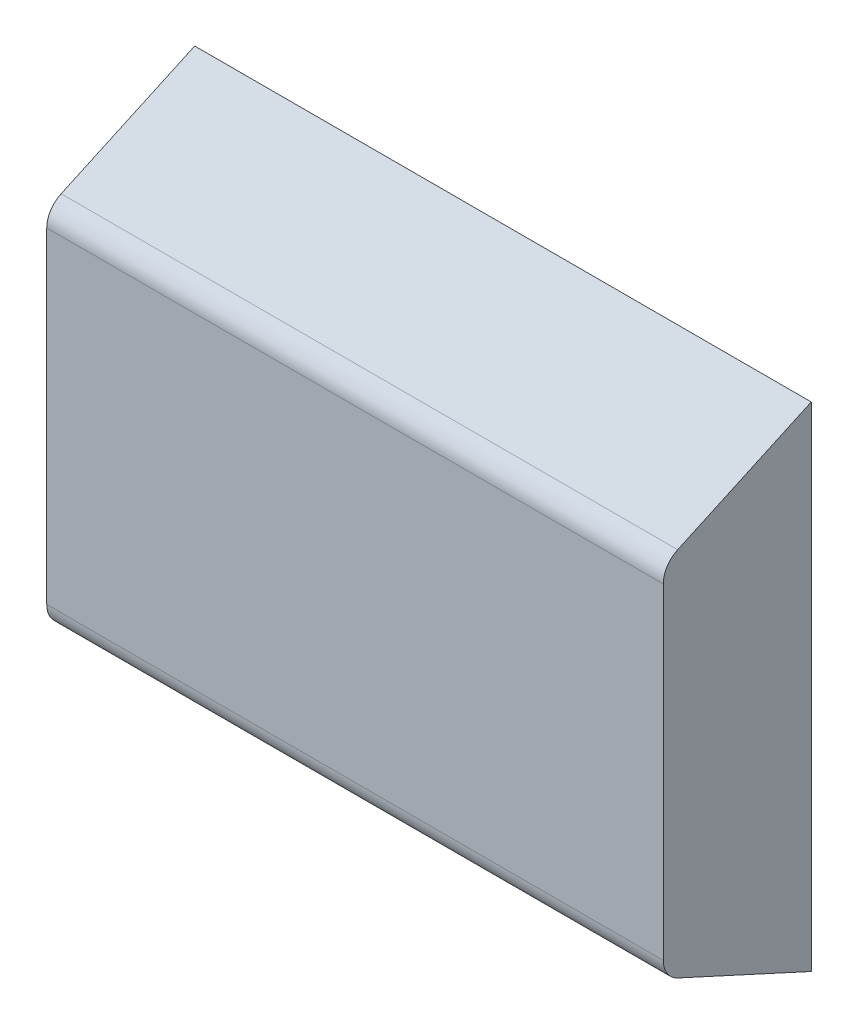
ISO-10303-21;
HEADER;
FILE_DESCRIPTION(('STEP AP214'),'2;1');
FILE_NAME('part.step','',(''),(''),'','','');
FILE_SCHEMA(('AUTOMOTIVE_DESIGN { 1 0 10303 214 1 1 1 1 }'));
ENDSEC;
DATA;
#1=APPLICATION_CONTEXT('core data for automotive mechanical design processes');
#2=APPLICATION_PROTOCOL_DEFINITION('international standard','automotive_design',2000,#1);
#3=PRODUCT_CONTEXT('',#1,'mechanical');
#4=PRODUCT('Part','Part','',(#3));
#5=PRODUCT_RELATED_PRODUCT_CATEGORY('part','',(#4));
#6=PRODUCT_DEFINITION_FORMATION('','',#4);
#7=PRODUCT_DEFINITION_CONTEXT('part definition',#1,'design');
#8=PRODUCT_DEFINITION('design','',#6,#7);
#9=PRODUCT_DEFINITION_SHAPE('','',#8);
#10=(LENGTH_UNIT() NAMED_UNIT(*) SI_UNIT(.MILLI.,.METRE.));
#11=(NAMED_UNIT(*) PLANE_ANGLE_UNIT() SI_UNIT($,.RADIAN.));
#12=(NAMED_UNIT(*) SI_UNIT($,.STERADIAN.) SOLID_ANGLE_UNIT());
#13=UNCERTAINTY_MEASURE_WITH_UNIT(LENGTH_MEASURE(1.E-05),#10,'distance_accuracy_value','');
#14=(GEOMETRIC_REPRESENTATION_CONTEXT(3) GLOBAL_UNCERTAINTY_ASSIGNED_CONTEXT((#13)) GLOBAL_UNIT_ASSIGNED_CONTEXT((#10,
#11,#12)) REPRESENTATION_CONTEXT('',''));
#15=CARTESIAN_POINT('',(0.,0.,0.));
#16=DIRECTION('',(0.,0.,1.));
#17=DIRECTION('',(1.,0.,0.));
#18=AXIS2_PLACEMENT_3D('',#15,#16,#17);
#19=CARTESIAN_POINT('',(0.,0.5,1.1));
#20=DIRECTION('',(0.,0.,1.));
#21=DIRECTION('',(1.,0.,0.));
#22=AXIS2_PLACEMENT_3D('',#19,#20,#21);
#23=PLANE('',#22);
#24=DIRECTION('',(0.,1.,0.));
#25=VECTOR('',#24,1.);
#26=CARTESIAN_POINT('',(0.,0.5,1.1));
#27=LINE('',#26,#25);
#28=CARTESIAN_POINT('',(0.,2.161099693397,1.1));
#29=VERTEX_POINT('',#28);
#30=CARTESIAN_POINT('',(0.,0.838900306603,1.1));
#31=VERTEX_POINT('',#30);
#32=EDGE_CURVE('E73',#29,#31,#27,.F.);
#33=ORIENTED_EDGE('',*,*,#32,.T.);
#34=DIRECTION('',(1.,0.,0.));
#35=VECTOR('',#34,1.);
#36=CARTESIAN_POINT('',(0.,0.838900306603,1.1));
#37=LINE('',#36,#35);
#38=CARTESIAN_POINT('',(2.5,0.838900306603,1.1));
#39=VERTEX_POINT('',#38);
#40=EDGE_CURVE('E123',#39,#31,#37,.F.);
#41=ORIENTED_EDGE('',*,*,#40,.F.);
#42=DIRECTION('',(0.,1.,0.));
#43=VECTOR('',#42,1.);
#44=CARTESIAN_POINT('',(2.5,0.5,1.1));
#45=LINE('',#44,#43);
#46=CARTESIAN_POINT('',(2.5,2.161099693397,1.1));
#47=VERTEX_POINT('',#46);
#48=EDGE_CURVE('E126',#39,#47,#45,.T.);
#49=ORIENTED_EDGE('',*,*,#48,.T.);
#50=DIRECTION('',(1.,0.,0.));
#51=VECTOR('',#50,1.);
#52=CARTESIAN_POINT('',(0.,2.161099693397,1.1));
#53=LINE('',#52,#51);
#54=EDGE_CURVE('E77',#29,#47,#53,.T.);
#55=ORIENTED_EDGE('',*,*,#54,.F.);
#56=EDGE_LOOP('',(#33,#41,#49,#55));
#57=FACE_BOUND('',#56,.T.);
#58=ADVANCED_FACE('F17',(#57),#23,.T.);
#59=CARTESIAN_POINT('',(0.,2.161099693397,1.));
#60=DIRECTION('',(1.,0.,0.));
#61=DIRECTION('',(0.,0.,-1.));
#62=AXIS2_PLACEMENT_3D('',#59,#60,#61);
#63=CYLINDRICAL_SURFACE('',#62,0.1);
#64=ORIENTED_EDGE('',*,*,#54,.T.);
#65=CARTESIAN_POINT('',(2.5,2.161099693397,1.));
#66=DIRECTION('',(1.,0.,0.));
#67=DIRECTION('',(0.,0.,-1.));
#68=AXIS2_PLACEMENT_3D('',#65,#66,#67);
#69=CIRCLE('',#68,0.1);
#70=CARTESIAN_POINT('',(2.5,2.25202330430211,1.04162807922615));
#71=VERTEX_POINT('',#70);
#72=EDGE_CURVE('E82',#47,#71,#69,.F.);
#73=ORIENTED_EDGE('',*,*,#72,.T.);
#74=DIRECTION('',(1.,0.,0.));
#75=VECTOR('',#74,1.);
#76=CARTESIAN_POINT('',(0.,2.25202330430229,1.04162807922613));
#77=LINE('',#76,#75);
#78=CARTESIAN_POINT('',(0.,2.25202330430211,1.04162807922615));
#79=VERTEX_POINT('',#78);
#80=EDGE_CURVE('E79',#79,#71,#77,.T.);
#81=ORIENTED_EDGE('',*,*,#80,.F.);
#82=CARTESIAN_POINT('',(0.,2.161099693397,1.));
#83=DIRECTION('',(1.,0.,0.));
#84=DIRECTION('',(0.,0.,-1.));
#85=AXIS2_PLACEMENT_3D('',#82,#83,#84);
#86=CIRCLE('',#85,0.1);
#87=EDGE_CURVE('E20',#79,#29,#86,.T.);
#88=ORIENTED_EDGE('',*,*,#87,.T.);
#89=EDGE_LOOP('',(#64,#73,#81,#88));
#90=FACE_BOUND('',#89,.T.);
#91=ADVANCED_FACE('F80',(#90),#63,.T.);
#92=CARTESIAN_POINT('',(0.,0.838900306603,1.));
#93=DIRECTION('',(1.,0.,0.));
#94=DIRECTION('',(0.,0.,-1.));
#95=AXIS2_PLACEMENT_3D('',#92,#93,#94);
#96=CYLINDRICAL_SURFACE('',#95,0.1);
#97=DIRECTION('',(1.,0.,0.));
#98=VECTOR('',#97,1.);
#99=CARTESIAN_POINT('',(0.,0.747976695697709,1.04162807922613));
#100=LINE('',#99,#98);
#101=CARTESIAN_POINT('',(0.,0.747976695697735,1.04162807922619));
#102=VERTEX_POINT('',#101);
#103=CARTESIAN_POINT('',(2.5,0.747976695697892,1.04162807922615));
#104=VERTEX_POINT('',#103);
#105=EDGE_CURVE('E92',#102,#104,#100,.T.);
#106=ORIENTED_EDGE('',*,*,#105,.T.);
#107=CARTESIAN_POINT('',(2.5,0.838900306603,1.));
#108=DIRECTION('',(1.,0.,0.));
#109=DIRECTION('',(0.,0.,-1.));
#110=AXIS2_PLACEMENT_3D('',#107,#108,#109);
#111=CIRCLE('',#110,0.1);
#112=EDGE_CURVE('E87',#104,#39,#111,.F.);
#113=ORIENTED_EDGE('',*,*,#112,.T.);
#114=ORIENTED_EDGE('',*,*,#40,.T.);
#115=CARTESIAN_POINT('',(0.,0.838900306603,1.));
#116=DIRECTION('',(1.,0.,0.));
#117=DIRECTION('',(0.,0.,-1.));
#118=AXIS2_PLACEMENT_3D('',#115,#116,#117);
#119=CIRCLE('',#118,0.1);
#120=EDGE_CURVE('E86',#31,#102,#119,.T.);
#121=ORIENTED_EDGE('',*,*,#120,.T.);
#122=EDGE_LOOP('',(#106,#113,#114,#121));
#123=FACE_BOUND('',#122,.T.);
#124=ADVANCED_FACE('F133',(#123),#96,.T.);
#125=CARTESIAN_POINT('',(0.,2.5,0.5));
#126=DIRECTION('',(0.,0.909236109047209,0.416280792260095));
#127=DIRECTION('',(0.,-0.416280792260095,0.909236109047209));
#128=AXIS2_PLACEMENT_3D('',#125,#126,#127);
#129=PLANE('',#128);
#130=DIRECTION('',(0.,-0.416280792260584,0.909236109046985));
#131=VECTOR('',#130,1.);
#132=CARTESIAN_POINT('',(2.5,2.5,0.5));
#133=LINE('',#132,#131);
#134=CARTESIAN_POINT('',(2.5,2.5,0.5));
#135=VERTEX_POINT('',#134);
#136=EDGE_CURVE('E117',#135,#71,#133,.T.);
#137=ORIENTED_EDGE('',*,*,#136,.F.);
#138=DIRECTION('',(1.,0.,0.));
#139=VECTOR('',#138,1.);
#140=CARTESIAN_POINT('',(0.,2.5,0.5));
#141=LINE('',#140,#139);
#142=CARTESIAN_POINT('',(0.,2.5,0.5));
#143=VERTEX_POINT('',#142);
#144=EDGE_CURVE('E91',#135,#143,#141,.F.);
#145=ORIENTED_EDGE('',*,*,#144,.T.);
#146=DIRECTION('',(0.,-0.416280792260584,0.909236109046985));
#147=VECTOR('',#146,1.);
#148=CARTESIAN_POINT('',(0.,2.5,0.5));
#149=LINE('',#148,#147);
#150=EDGE_CURVE('E70',#143,#79,#149,.T.);
#151=ORIENTED_EDGE('',*,*,#150,.T.);
#152=ORIENTED_EDGE('',*,*,#80,.T.);
#153=EDGE_LOOP('',(#137,#145,#151,#152));
#154=FACE_BOUND('',#153,.T.);
#155=ADVANCED_FACE('F90',(#154),#129,.T.);
#156=CARTESIAN_POINT('',(0.,0.5,0.5));
#157=DIRECTION('',(1.,0.,0.));
#158=DIRECTION('',(0.,0.,-1.));
#159=AXIS2_PLACEMENT_3D('',#156,#157,#158);
#160=PLANE('',#159);
#161=DIRECTION('',(0.,1.,0.));
#162=VECTOR('',#161,1.);
#163=CARTESIAN_POINT('',(0.,0.5,0.5));
#164=LINE('',#163,#162);
#165=CARTESIAN_POINT('',(0.,0.5,0.5));
#166=VERTEX_POINT('',#165);
#167=EDGE_CURVE('E109',#143,#166,#164,.F.);
#168=ORIENTED_EDGE('',*,*,#167,.T.);
#169=DIRECTION('',(0.,0.416280792260095,0.909236109047209));
#170=VECTOR('',#169,1.);
#171=CARTESIAN_POINT('',(0.,0.5,0.5));
#172=LINE('',#171,#170);
#173=EDGE_CURVE('E95',#166,#102,#172,.T.);
#174=ORIENTED_EDGE('',*,*,#173,.T.);
#175=ORIENTED_EDGE('',*,*,#120,.F.);
#176=ORIENTED_EDGE('',*,*,#32,.F.);
#177=ORIENTED_EDGE('',*,*,#87,.F.);
#178=ORIENTED_EDGE('',*,*,#150,.F.);
#179=EDGE_LOOP('',(#168,#174,#175,#176,#177,#178));
#180=FACE_BOUND('',#179,.T.);
#181=ADVANCED_FACE('F68',(#180),#160,.F.);
#182=CARTESIAN_POINT('',(0.,0.5,0.5));
#183=DIRECTION('',(0.,0.909236109047209,-0.416280792260095));
#184=DIRECTION('',(0.,0.416280792260095,0.909236109047209));
#185=AXIS2_PLACEMENT_3D('',#182,#183,#184);
#186=PLANE('',#185);
#187=DIRECTION('',(1.,0.,0.));
#188=VECTOR('',#187,1.);
#189=CARTESIAN_POINT('',(0.,0.5,0.5));
#190=LINE('',#189,#188);
#191=CARTESIAN_POINT('',(2.5,0.5,0.5));
#192=VERTEX_POINT('',#191);
#193=EDGE_CURVE('E26',#166,#192,#190,.T.);
#194=ORIENTED_EDGE('',*,*,#193,.T.);
#195=DIRECTION('',(0.,-0.416280792260584,-0.909236109046985));
#196=VECTOR('',#195,1.);
#197=CARTESIAN_POINT('',(2.5,0.747976695698,1.041628079226));
#198=LINE('',#197,#196);
#199=EDGE_CURVE('E34',#104,#192,#198,.T.);
#200=ORIENTED_EDGE('',*,*,#199,.F.);
#201=ORIENTED_EDGE('',*,*,#105,.F.);
#202=ORIENTED_EDGE('',*,*,#173,.F.);
#203=EDGE_LOOP('',(#194,#200,#201,#202));
#204=FACE_BOUND('',#203,.T.);
#205=ADVANCED_FACE('F143',(#204),#186,.F.);
#206=CARTESIAN_POINT('',(2.5,0.5,0.5));
#207=DIRECTION('',(1.,0.,0.));
#208=DIRECTION('',(0.,0.,-1.));
#209=AXIS2_PLACEMENT_3D('',#206,#207,#208);
#210=PLANE('',#209);
#211=ORIENTED_EDGE('',*,*,#199,.T.);
#212=DIRECTION('',(0.,1.,0.));
#213=VECTOR('',#212,1.);
#214=CARTESIAN_POINT('',(2.5,0.5,0.5));
#215=LINE('',#214,#213);
#216=EDGE_CURVE('E11',#192,#135,#215,.T.);
#217=ORIENTED_EDGE('',*,*,#216,.T.);
#218=ORIENTED_EDGE('',*,*,#136,.T.);
#219=ORIENTED_EDGE('',*,*,#72,.F.);
#220=ORIENTED_EDGE('',*,*,#48,.F.);
#221=ORIENTED_EDGE('',*,*,#112,.F.);
#222=EDGE_LOOP('',(#211,#217,#218,#219,#220,#221));
#223=FACE_BOUND('',#222,.T.);
#224=ADVANCED_FACE('F135',(#223),#210,.T.);
#225=CARTESIAN_POINT('',(0.,0.5,0.5));
#226=DIRECTION('',(0.,0.,1.));
#227=DIRECTION('',(1.,0.,0.));
#228=AXIS2_PLACEMENT_3D('',#225,#226,#227);
#229=PLANE('',#228);
#230=ORIENTED_EDGE('',*,*,#193,.F.);
#231=ORIENTED_EDGE('',*,*,#167,.F.);
#232=ORIENTED_EDGE('',*,*,#144,.F.);
#233=ORIENTED_EDGE('',*,*,#216,.F.);
#234=EDGE_LOOP('',(#230,#231,#232,#233));
#235=FACE_BOUND('',#234,.T.);
#236=ADVANCED_FACE('F141',(#235),#229,.F.);
#237=CLOSED_SHELL('',(#58,#91,#124,#155,#181,#205,#224,#236));
#238=MANIFOLD_SOLID_BREP('B1',#237);
#239=ADVANCED_BREP_SHAPE_REPRESENTATION('',(#18,#238),#14);
#240=SHAPE_DEFINITION_REPRESENTATION(#9,#239);
ENDSEC;
END-ISO-10303-21;
